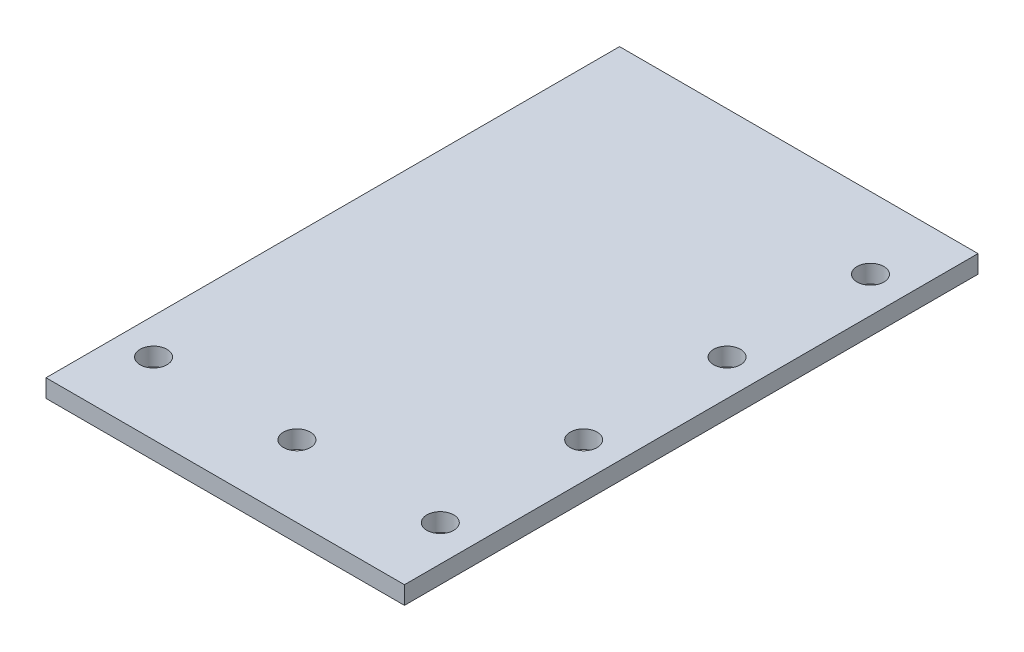
ISO-10303-21;
HEADER;
FILE_DESCRIPTION(('STEP AP214'),'2;1');
FILE_NAME('part.step','',(''),(''),'','','');
FILE_SCHEMA(('AUTOMOTIVE_DESIGN { 1 0 10303 214 1 1 1 1 }'));
ENDSEC;
DATA;
#1=APPLICATION_CONTEXT('core data for automotive mechanical design processes');
#2=APPLICATION_PROTOCOL_DEFINITION('international standard','automotive_design',2000,#1);
#3=PRODUCT_CONTEXT('',#1,'mechanical');
#4=PRODUCT('Part','Part','',(#3));
#5=PRODUCT_RELATED_PRODUCT_CATEGORY('part','',(#4));
#6=PRODUCT_DEFINITION_FORMATION('','',#4);
#7=PRODUCT_DEFINITION_CONTEXT('part definition',#1,'design');
#8=PRODUCT_DEFINITION('design','',#6,#7);
#9=PRODUCT_DEFINITION_SHAPE('','',#8);
#10=(LENGTH_UNIT() NAMED_UNIT(*) SI_UNIT(.MILLI.,.METRE.));
#11=(NAMED_UNIT(*) PLANE_ANGLE_UNIT() SI_UNIT($,.RADIAN.));
#12=(NAMED_UNIT(*) SI_UNIT($,.STERADIAN.) SOLID_ANGLE_UNIT());
#13=UNCERTAINTY_MEASURE_WITH_UNIT(LENGTH_MEASURE(1.E-05),#10,'distance_accuracy_value','');
#14=(GEOMETRIC_REPRESENTATION_CONTEXT(3) GLOBAL_UNCERTAINTY_ASSIGNED_CONTEXT((#13)) GLOBAL_UNIT_ASSIGNED_CONTEXT((#10,
#11,#12)) REPRESENTATION_CONTEXT('',''));
#15=CARTESIAN_POINT('',(0.,0.,0.));
#16=DIRECTION('',(0.,0.,1.));
#17=DIRECTION('',(1.,0.,0.));
#18=AXIS2_PLACEMENT_3D('',#15,#16,#17);
#19=CARTESIAN_POINT('',(31.75,3.175,-50.8));
#20=DIRECTION('',(-1.,0.,0.));
#21=DIRECTION('',(0.,0.,1.));
#22=AXIS2_PLACEMENT_3D('',#19,#20,#21);
#23=PLANE('',#22);
#24=DIRECTION('',(0.,0.,-1.));
#25=VECTOR('',#24,1.);
#26=CARTESIAN_POINT('',(31.75,0.,-50.8));
#27=LINE('',#26,#25);
#28=CARTESIAN_POINT('',(31.75,0.,50.8));
#29=VERTEX_POINT('',#28);
#30=CARTESIAN_POINT('',(31.75,0.,-50.8));
#31=VERTEX_POINT('',#30);
#32=EDGE_CURVE('E100',#29,#31,#27,.T.);
#33=ORIENTED_EDGE('',*,*,#32,.T.);
#34=DIRECTION('',(0.,-1.,0.));
#35=VECTOR('',#34,1.);
#36=CARTESIAN_POINT('',(31.75,3.175,-50.8));
#37=LINE('',#36,#35);
#38=CARTESIAN_POINT('',(31.75,3.175,-50.8));
#39=VERTEX_POINT('',#38);
#40=EDGE_CURVE('E11',#39,#31,#37,.T.);
#41=ORIENTED_EDGE('',*,*,#40,.F.);
#42=DIRECTION('',(0.,0.,-1.));
#43=VECTOR('',#42,1.);
#44=CARTESIAN_POINT('',(31.75,3.175,-50.8));
#45=LINE('',#44,#43);
#46=CARTESIAN_POINT('',(31.75,3.175,50.8));
#47=VERTEX_POINT('',#46);
#48=EDGE_CURVE('E88',#47,#39,#45,.T.);
#49=ORIENTED_EDGE('',*,*,#48,.F.);
#50=DIRECTION('',(0.,-1.,0.));
#51=VECTOR('',#50,1.);
#52=CARTESIAN_POINT('',(31.75,3.175,50.8));
#53=LINE('',#52,#51);
#54=EDGE_CURVE('E96',#47,#29,#53,.T.);
#55=ORIENTED_EDGE('',*,*,#54,.T.);
#56=EDGE_LOOP('',(#33,#41,#49,#55));
#57=FACE_BOUND('',#56,.T.);
#58=ADVANCED_FACE('F37',(#57),#23,.F.);
#59=CARTESIAN_POINT('',(-31.75,3.175,-50.8));
#60=DIRECTION('',(0.,0.,1.));
#61=DIRECTION('',(1.,0.,0.));
#62=AXIS2_PLACEMENT_3D('',#59,#60,#61);
#63=PLANE('',#62);
#64=DIRECTION('',(-1.,0.,0.));
#65=VECTOR('',#64,1.);
#66=CARTESIAN_POINT('',(-31.75,0.,-50.8));
#67=LINE('',#66,#65);
#68=CARTESIAN_POINT('',(-31.75,0.,-50.8));
#69=VERTEX_POINT('',#68);
#70=EDGE_CURVE('E92',#31,#69,#67,.T.);
#71=ORIENTED_EDGE('',*,*,#70,.T.);
#72=DIRECTION('',(0.,-1.,0.));
#73=VECTOR('',#72,1.);
#74=CARTESIAN_POINT('',(-31.75,3.175,-50.8));
#75=LINE('',#74,#73);
#76=CARTESIAN_POINT('',(-31.75,3.175,-50.8));
#77=VERTEX_POINT('',#76);
#78=EDGE_CURVE('E45',#77,#69,#75,.T.);
#79=ORIENTED_EDGE('',*,*,#78,.F.);
#80=DIRECTION('',(-1.,0.,0.));
#81=VECTOR('',#80,1.);
#82=CARTESIAN_POINT('',(-31.75,3.175,-50.8));
#83=LINE('',#82,#81);
#84=EDGE_CURVE('E83',#39,#77,#83,.T.);
#85=ORIENTED_EDGE('',*,*,#84,.F.);
#86=ORIENTED_EDGE('',*,*,#40,.T.);
#87=EDGE_LOOP('',(#71,#79,#85,#86));
#88=FACE_BOUND('',#87,.T.);
#89=ADVANCED_FACE('F91',(#88),#63,.F.);
#90=CARTESIAN_POINT('',(-31.75,3.175,-50.8));
#91=DIRECTION('',(1.,0.,0.));
#92=DIRECTION('',(0.,0.,-1.));
#93=AXIS2_PLACEMENT_3D('',#90,#91,#92);
#94=PLANE('',#93);
#95=DIRECTION('',(0.,0.,1.));
#96=VECTOR('',#95,1.);
#97=CARTESIAN_POINT('',(-31.75,0.,-50.8));
#98=LINE('',#97,#96);
#99=CARTESIAN_POINT('',(-31.75,0.,50.8));
#100=VERTEX_POINT('',#99);
#101=EDGE_CURVE('E70',#69,#100,#98,.T.);
#102=ORIENTED_EDGE('',*,*,#101,.T.);
#103=DIRECTION('',(0.,-1.,0.));
#104=VECTOR('',#103,1.);
#105=CARTESIAN_POINT('',(-31.75,3.175,50.8));
#106=LINE('',#105,#104);
#107=CARTESIAN_POINT('',(-31.75,3.175,50.8));
#108=VERTEX_POINT('',#107);
#109=EDGE_CURVE('E93',#108,#100,#106,.T.);
#110=ORIENTED_EDGE('',*,*,#109,.F.);
#111=DIRECTION('',(0.,0.,1.));
#112=VECTOR('',#111,1.);
#113=CARTESIAN_POINT('',(-31.75,3.175,-50.8));
#114=LINE('',#113,#112);
#115=EDGE_CURVE('E86',#77,#108,#114,.T.);
#116=ORIENTED_EDGE('',*,*,#115,.F.);
#117=ORIENTED_EDGE('',*,*,#78,.T.);
#118=EDGE_LOOP('',(#102,#110,#116,#117));
#119=FACE_BOUND('',#118,.T.);
#120=ADVANCED_FACE('F94',(#119),#94,.F.);
#121=CARTESIAN_POINT('',(-31.75,3.175,50.8));
#122=DIRECTION('',(0.,0.,-1.));
#123=DIRECTION('',(-1.,0.,0.));
#124=AXIS2_PLACEMENT_3D('',#121,#122,#123);
#125=PLANE('',#124);
#126=DIRECTION('',(1.,0.,0.));
#127=VECTOR('',#126,1.);
#128=CARTESIAN_POINT('',(-31.75,0.,50.8));
#129=LINE('',#128,#127);
#130=EDGE_CURVE('E76',#100,#29,#129,.T.);
#131=ORIENTED_EDGE('',*,*,#130,.T.);
#132=ORIENTED_EDGE('',*,*,#54,.F.);
#133=DIRECTION('',(1.,0.,0.));
#134=VECTOR('',#133,1.);
#135=CARTESIAN_POINT('',(-31.75,3.175,50.8));
#136=LINE('',#135,#134);
#137=EDGE_CURVE('E53',#108,#47,#136,.T.);
#138=ORIENTED_EDGE('',*,*,#137,.F.);
#139=ORIENTED_EDGE('',*,*,#109,.T.);
#140=EDGE_LOOP('',(#131,#132,#138,#139));
#141=FACE_BOUND('',#140,.T.);
#142=ADVANCED_FACE('F108',(#141),#125,.F.);
#143=CARTESIAN_POINT('',(0.,3.175,0.));
#144=DIRECTION('',(0.,1.,0.));
#145=DIRECTION('',(0.,0.,1.));
#146=AXIS2_PLACEMENT_3D('',#143,#144,#145);
#147=PLANE('',#146);
#148=CARTESIAN_POINT('',(-25.4,3.175,38.1000000000003));
#149=DIRECTION('',(0.,1.,0.));
#150=DIRECTION('',(0.,0.,1.));
#151=AXIS2_PLACEMENT_3D('',#148,#149,#150);
#152=CIRCLE('',#151,2.38125);
#153=CARTESIAN_POINT('',(-25.4,3.175,40.4812500000003));
#154=VERTEX_POINT('',#153);
#155=EDGE_CURVE('E123',#154,#154,#152,.T.);
#156=ORIENTED_EDGE('',*,*,#155,.F.);
#157=EDGE_LOOP('',(#156));
#158=FACE_BOUND('',#157,.T.);
#159=CARTESIAN_POINT('',(25.4,3.175,12.7));
#160=DIRECTION('',(0.,1.,0.));
#161=DIRECTION('',(0.,0.,1.));
#162=AXIS2_PLACEMENT_3D('',#159,#160,#161);
#163=CIRCLE('',#162,2.38125);
#164=CARTESIAN_POINT('',(25.4,3.175,15.08125));
#165=VERTEX_POINT('',#164);
#166=EDGE_CURVE('E117',#165,#165,#163,.T.);
#167=ORIENTED_EDGE('',*,*,#166,.F.);
#168=EDGE_LOOP('',(#167));
#169=FACE_BOUND('',#168,.T.);
#170=CARTESIAN_POINT('',(25.4,3.175,-12.7));
#171=DIRECTION('',(0.,1.,0.));
#172=DIRECTION('',(0.,0.,1.));
#173=AXIS2_PLACEMENT_3D('',#170,#171,#172);
#174=CIRCLE('',#173,2.38125);
#175=CARTESIAN_POINT('',(25.4,3.175,-10.31875));
#176=VERTEX_POINT('',#175);
#177=EDGE_CURVE('E130',#176,#176,#174,.T.);
#178=ORIENTED_EDGE('',*,*,#177,.F.);
#179=EDGE_LOOP('',(#178));
#180=FACE_BOUND('',#179,.T.);
#181=CARTESIAN_POINT('',(25.4,3.175,-38.1));
#182=DIRECTION('',(0.,1.,0.));
#183=DIRECTION('',(0.,0.,1.));
#184=AXIS2_PLACEMENT_3D('',#181,#182,#183);
#185=CIRCLE('',#184,2.38125);
#186=CARTESIAN_POINT('',(25.4,3.175,-35.71875));
#187=VERTEX_POINT('',#186);
#188=EDGE_CURVE('E131',#187,#187,#185,.T.);
#189=ORIENTED_EDGE('',*,*,#188,.F.);
#190=EDGE_LOOP('',(#189));
#191=FACE_BOUND('',#190,.T.);
#192=CARTESIAN_POINT('',(0.,3.175,38.1000000000002));
#193=DIRECTION('',(0.,1.,0.));
#194=DIRECTION('',(0.,0.,1.));
#195=AXIS2_PLACEMENT_3D('',#192,#193,#194);
#196=CIRCLE('',#195,2.38125);
#197=CARTESIAN_POINT('',(0.,3.175,40.4812500000002));
#198=VERTEX_POINT('',#197);
#199=EDGE_CURVE('E141',#198,#198,#196,.T.);
#200=ORIENTED_EDGE('',*,*,#199,.F.);
#201=EDGE_LOOP('',(#200));
#202=FACE_BOUND('',#201,.T.);
#203=CARTESIAN_POINT('',(25.4,3.175,38.1));
#204=DIRECTION('',(0.,1.,0.));
#205=DIRECTION('',(0.,0.,1.));
#206=AXIS2_PLACEMENT_3D('',#203,#204,#205);
#207=CIRCLE('',#206,2.38125);
#208=CARTESIAN_POINT('',(25.4,3.175,40.48125));
#209=VERTEX_POINT('',#208);
#210=EDGE_CURVE('E114',#209,#209,#207,.T.);
#211=ORIENTED_EDGE('',*,*,#210,.F.);
#212=EDGE_LOOP('',(#211));
#213=FACE_BOUND('',#212,.T.);
#214=ORIENTED_EDGE('',*,*,#48,.T.);
#215=ORIENTED_EDGE('',*,*,#84,.T.);
#216=ORIENTED_EDGE('',*,*,#115,.T.);
#217=ORIENTED_EDGE('',*,*,#137,.T.);
#218=EDGE_LOOP('',(#214,#215,#216,#217));
#219=FACE_BOUND('',#218,.T.);
#220=ADVANCED_FACE('F84',(#158,#169,#180,#191,#202,#213,#219),#147,.T.);
#221=CARTESIAN_POINT('',(0.,0.,0.));
#222=DIRECTION('',(0.,1.,0.));
#223=DIRECTION('',(0.,0.,1.));
#224=AXIS2_PLACEMENT_3D('',#221,#222,#223);
#225=PLANE('',#224);
#226=CARTESIAN_POINT('',(-25.4,0.,38.1000000000003));
#227=DIRECTION('',(0.,1.,0.));
#228=DIRECTION('',(0.,0.,1.));
#229=AXIS2_PLACEMENT_3D('',#226,#227,#228);
#230=CIRCLE('',#229,2.38125);
#231=CARTESIAN_POINT('',(-25.4,0.,40.4812500000003));
#232=VERTEX_POINT('',#231);
#233=EDGE_CURVE('E120',#232,#232,#230,.T.);
#234=ORIENTED_EDGE('',*,*,#233,.T.);
#235=EDGE_LOOP('',(#234));
#236=FACE_BOUND('',#235,.T.);
#237=CARTESIAN_POINT('',(25.4,0.,12.7));
#238=DIRECTION('',(0.,1.,0.));
#239=DIRECTION('',(0.,0.,1.));
#240=AXIS2_PLACEMENT_3D('',#237,#238,#239);
#241=CIRCLE('',#240,2.38125);
#242=CARTESIAN_POINT('',(25.4,0.,15.08125));
#243=VERTEX_POINT('',#242);
#244=EDGE_CURVE('E134',#243,#243,#241,.T.);
#245=ORIENTED_EDGE('',*,*,#244,.T.);
#246=EDGE_LOOP('',(#245));
#247=FACE_BOUND('',#246,.T.);
#248=CARTESIAN_POINT('',(25.4,0.,-12.7));
#249=DIRECTION('',(0.,1.,0.));
#250=DIRECTION('',(0.,0.,1.));
#251=AXIS2_PLACEMENT_3D('',#248,#249,#250);
#252=CIRCLE('',#251,2.38125);
#253=CARTESIAN_POINT('',(25.4,0.,-10.31875));
#254=VERTEX_POINT('',#253);
#255=EDGE_CURVE('E127',#254,#254,#252,.T.);
#256=ORIENTED_EDGE('',*,*,#255,.T.);
#257=EDGE_LOOP('',(#256));
#258=FACE_BOUND('',#257,.T.);
#259=CARTESIAN_POINT('',(25.4,0.,-38.1));
#260=DIRECTION('',(0.,1.,0.));
#261=DIRECTION('',(0.,0.,1.));
#262=AXIS2_PLACEMENT_3D('',#259,#260,#261);
#263=CIRCLE('',#262,2.38125);
#264=CARTESIAN_POINT('',(25.4,0.,-35.71875));
#265=VERTEX_POINT('',#264);
#266=EDGE_CURVE('E144',#265,#265,#263,.T.);
#267=ORIENTED_EDGE('',*,*,#266,.T.);
#268=EDGE_LOOP('',(#267));
#269=FACE_BOUND('',#268,.T.);
#270=CARTESIAN_POINT('',(0.,0.,38.1000000000002));
#271=DIRECTION('',(0.,1.,0.));
#272=DIRECTION('',(0.,0.,1.));
#273=AXIS2_PLACEMENT_3D('',#270,#271,#272);
#274=CIRCLE('',#273,2.38125);
#275=CARTESIAN_POINT('',(0.,0.,40.4812500000002));
#276=VERTEX_POINT('',#275);
#277=EDGE_CURVE('E126',#276,#276,#274,.T.);
#278=ORIENTED_EDGE('',*,*,#277,.T.);
#279=EDGE_LOOP('',(#278));
#280=FACE_BOUND('',#279,.T.);
#281=CARTESIAN_POINT('',(25.4,0.,38.1));
#282=DIRECTION('',(0.,1.,0.));
#283=DIRECTION('',(0.,0.,1.));
#284=AXIS2_PLACEMENT_3D('',#281,#282,#283);
#285=CIRCLE('',#284,2.38125);
#286=CARTESIAN_POINT('',(25.4,0.,40.48125));
#287=VERTEX_POINT('',#286);
#288=EDGE_CURVE('E103',#287,#287,#285,.T.);
#289=ORIENTED_EDGE('',*,*,#288,.T.);
#290=EDGE_LOOP('',(#289));
#291=FACE_BOUND('',#290,.T.);
#292=ORIENTED_EDGE('',*,*,#32,.F.);
#293=ORIENTED_EDGE('',*,*,#130,.F.);
#294=ORIENTED_EDGE('',*,*,#101,.F.);
#295=ORIENTED_EDGE('',*,*,#70,.F.);
#296=EDGE_LOOP('',(#292,#293,#294,#295));
#297=FACE_BOUND('',#296,.T.);
#298=ADVANCED_FACE('F111',(#236,#247,#258,#269,#280,#291,#297),#225,.F.);
#299=CARTESIAN_POINT('',(25.4,0.,38.1));
#300=DIRECTION('',(0.,1.,0.));
#301=DIRECTION('',(0.,0.,1.));
#302=AXIS2_PLACEMENT_3D('',#299,#300,#301);
#303=CYLINDRICAL_SURFACE('',#302,2.38125);
#304=ORIENTED_EDGE('',*,*,#288,.F.);
#305=EDGE_LOOP('',(#304));
#306=FACE_BOUND('',#305,.T.);
#307=ORIENTED_EDGE('',*,*,#210,.T.);
#308=EDGE_LOOP('',(#307));
#309=FACE_BOUND('',#308,.T.);
#310=ADVANCED_FACE('F160',(#306,#309),#303,.F.);
#311=CARTESIAN_POINT('',(0.,0.,38.1000000000002));
#312=DIRECTION('',(0.,1.,0.));
#313=DIRECTION('',(0.,0.,1.));
#314=AXIS2_PLACEMENT_3D('',#311,#312,#313);
#315=CYLINDRICAL_SURFACE('',#314,2.38125);
#316=ORIENTED_EDGE('',*,*,#277,.F.);
#317=EDGE_LOOP('',(#316));
#318=FACE_BOUND('',#317,.T.);
#319=ORIENTED_EDGE('',*,*,#199,.T.);
#320=EDGE_LOOP('',(#319));
#321=FACE_BOUND('',#320,.T.);
#322=ADVANCED_FACE('F162',(#318,#321),#315,.F.);
#323=CARTESIAN_POINT('',(25.4,0.,-38.1));
#324=DIRECTION('',(0.,1.,0.));
#325=DIRECTION('',(0.,0.,1.));
#326=AXIS2_PLACEMENT_3D('',#323,#324,#325);
#327=CYLINDRICAL_SURFACE('',#326,2.38125);
#328=ORIENTED_EDGE('',*,*,#266,.F.);
#329=EDGE_LOOP('',(#328));
#330=FACE_BOUND('',#329,.T.);
#331=ORIENTED_EDGE('',*,*,#188,.T.);
#332=EDGE_LOOP('',(#331));
#333=FACE_BOUND('',#332,.T.);
#334=ADVANCED_FACE('F150',(#330,#333),#327,.F.);
#335=CARTESIAN_POINT('',(25.4,0.,-12.7));
#336=DIRECTION('',(0.,1.,0.));
#337=DIRECTION('',(0.,0.,1.));
#338=AXIS2_PLACEMENT_3D('',#335,#336,#337);
#339=CYLINDRICAL_SURFACE('',#338,2.38125);
#340=ORIENTED_EDGE('',*,*,#255,.F.);
#341=EDGE_LOOP('',(#340));
#342=FACE_BOUND('',#341,.T.);
#343=ORIENTED_EDGE('',*,*,#177,.T.);
#344=EDGE_LOOP('',(#343));
#345=FACE_BOUND('',#344,.T.);
#346=ADVANCED_FACE('F219',(#342,#345),#339,.F.);
#347=CARTESIAN_POINT('',(25.4,0.,12.7));
#348=DIRECTION('',(0.,1.,0.));
#349=DIRECTION('',(0.,0.,1.));
#350=AXIS2_PLACEMENT_3D('',#347,#348,#349);
#351=CYLINDRICAL_SURFACE('',#350,2.38125);
#352=ORIENTED_EDGE('',*,*,#244,.F.);
#353=EDGE_LOOP('',(#352));
#354=FACE_BOUND('',#353,.T.);
#355=ORIENTED_EDGE('',*,*,#166,.T.);
#356=EDGE_LOOP('',(#355));
#357=FACE_BOUND('',#356,.T.);
#358=ADVANCED_FACE('F230',(#354,#357),#351,.F.);
#359=CARTESIAN_POINT('',(-25.4,0.,38.1000000000003));
#360=DIRECTION('',(0.,1.,0.));
#361=DIRECTION('',(0.,0.,1.));
#362=AXIS2_PLACEMENT_3D('',#359,#360,#361);
#363=CYLINDRICAL_SURFACE('',#362,2.38125);
#364=ORIENTED_EDGE('',*,*,#233,.F.);
#365=EDGE_LOOP('',(#364));
#366=FACE_BOUND('',#365,.T.);
#367=ORIENTED_EDGE('',*,*,#155,.T.);
#368=EDGE_LOOP('',(#367));
#369=FACE_BOUND('',#368,.T.);
#370=ADVANCED_FACE('F241',(#366,#369),#363,.F.);
#371=CLOSED_SHELL('',(#58,#89,#120,#142,#220,#298,#310,#322,#334,#346,#358,#370));
#372=MANIFOLD_SOLID_BREP('B2',#371);
#373=ADVANCED_BREP_SHAPE_REPRESENTATION('',(#18,#372),#14);
#374=SHAPE_DEFINITION_REPRESENTATION(#9,#373);
ENDSEC;
END-ISO-10303-21;
